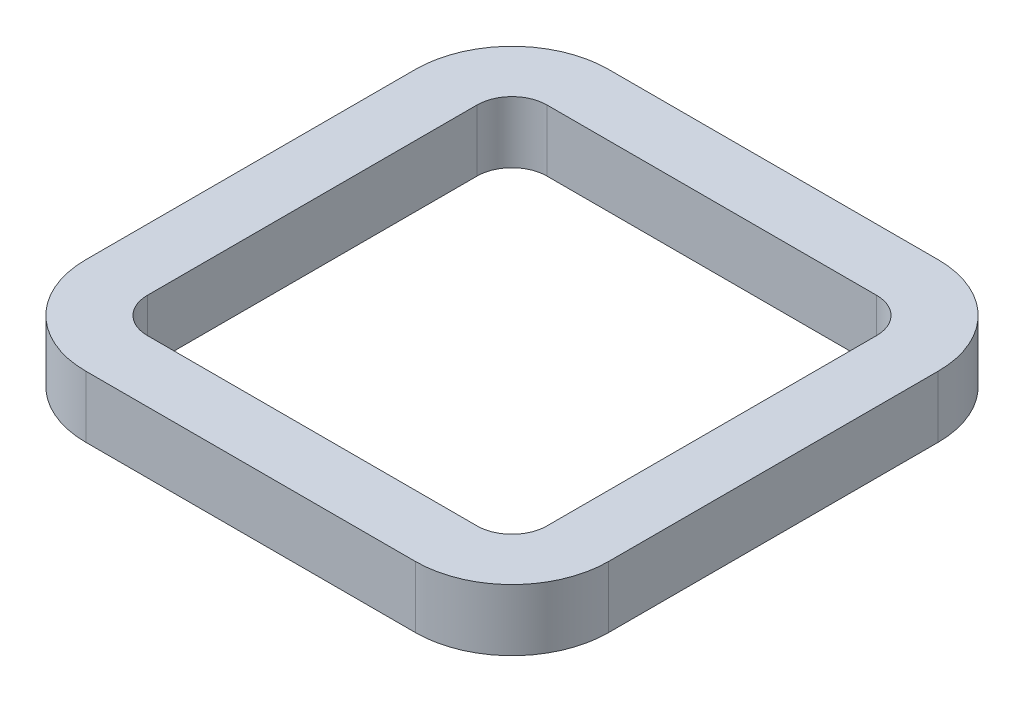
ISO-10303-21;
HEADER;
FILE_DESCRIPTION(('STEP AP214'),'2;1');
FILE_NAME('part.step','',(''),(''),'','','');
FILE_SCHEMA(('AUTOMOTIVE_DESIGN { 1 0 10303 214 1 1 1 1 }'));
ENDSEC;
DATA;
#1=APPLICATION_CONTEXT('core data for automotive mechanical design processes');
#2=APPLICATION_PROTOCOL_DEFINITION('international standard','automotive_design',2000,#1);
#3=PRODUCT_CONTEXT('',#1,'mechanical');
#4=PRODUCT('Part','Part','',(#3));
#5=PRODUCT_RELATED_PRODUCT_CATEGORY('part','',(#4));
#6=PRODUCT_DEFINITION_FORMATION('','',#4);
#7=PRODUCT_DEFINITION_CONTEXT('part definition',#1,'design');
#8=PRODUCT_DEFINITION('design','',#6,#7);
#9=PRODUCT_DEFINITION_SHAPE('','',#8);
#10=(LENGTH_UNIT() NAMED_UNIT(*) SI_UNIT(.MILLI.,.METRE.));
#11=(NAMED_UNIT(*) PLANE_ANGLE_UNIT() SI_UNIT($,.RADIAN.));
#12=(NAMED_UNIT(*) SI_UNIT($,.STERADIAN.) SOLID_ANGLE_UNIT());
#13=UNCERTAINTY_MEASURE_WITH_UNIT(LENGTH_MEASURE(1.E-05),#10,'distance_accuracy_value','');
#14=(GEOMETRIC_REPRESENTATION_CONTEXT(3) GLOBAL_UNCERTAINTY_ASSIGNED_CONTEXT((#13)) GLOBAL_UNIT_ASSIGNED_CONTEXT((#10,
#11,#12)) REPRESENTATION_CONTEXT('',''));
#15=CARTESIAN_POINT('',(0.,0.,0.));
#16=DIRECTION('',(0.,0.,1.));
#17=DIRECTION('',(1.,0.,0.));
#18=AXIS2_PLACEMENT_3D('',#15,#16,#17);
#19=CARTESIAN_POINT('',(-8.02499999999994,3.,-8.02499999999994));
#20=DIRECTION('',(0.,1.,0.));
#21=DIRECTION('',(0.,0.,1.));
#22=AXIS2_PLACEMENT_3D('',#19,#20,#21);
#23=PLANE('',#22);
#24=CARTESIAN_POINT('',(-8.02499999999994,3.,-8.02499999999994));
#25=DIRECTION('',(0.,1.,0.));
#26=DIRECTION('',(0.,0.,1.));
#27=AXIS2_PLACEMENT_3D('',#24,#25,#26);
#28=CIRCLE('',#27,4.70000000000006);
#29=CARTESIAN_POINT('',(-8.025,3.,-12.725));
#30=VERTEX_POINT('',#29);
#31=CARTESIAN_POINT('',(-12.725,3.,-8.025));
#32=VERTEX_POINT('',#31);
#33=EDGE_CURVE('E210',#30,#32,#28,.T.);
#34=ORIENTED_EDGE('',*,*,#33,.T.);
#35=DIRECTION('',(0.,0.,1.));
#36=VECTOR('',#35,1.);
#37=CARTESIAN_POINT('',(-12.725,3.,-8.025));
#38=LINE('',#37,#36);
#39=CARTESIAN_POINT('',(-12.725,3.,8.025));
#40=VERTEX_POINT('',#39);
#41=EDGE_CURVE('E213',#32,#40,#38,.T.);
#42=ORIENTED_EDGE('',*,*,#41,.T.);
#43=CARTESIAN_POINT('',(-8.02499999999994,3.,8.02500000000006));
#44=DIRECTION('',(0.,1.,0.));
#45=DIRECTION('',(0.,0.,1.));
#46=AXIS2_PLACEMENT_3D('',#43,#44,#45);
#47=CIRCLE('',#46,4.7);
#48=CARTESIAN_POINT('',(-8.02499999999994,3.,12.7250000000001));
#49=VERTEX_POINT('',#48);
#50=EDGE_CURVE('E216',#40,#49,#47,.T.);
#51=ORIENTED_EDGE('',*,*,#50,.T.);
#52=DIRECTION('',(1.,0.,0.));
#53=VECTOR('',#52,1.);
#54=CARTESIAN_POINT('',(-8.02500000000001,3.,12.725));
#55=LINE('',#54,#53);
#56=CARTESIAN_POINT('',(8.025,3.,12.725));
#57=VERTEX_POINT('',#56);
#58=EDGE_CURVE('E218',#49,#57,#55,.T.);
#59=ORIENTED_EDGE('',*,*,#58,.T.);
#60=CARTESIAN_POINT('',(8.02500000000006,3.,8.02500000000006));
#61=DIRECTION('',(0.,1.,0.));
#62=DIRECTION('',(0.,0.,1.));
#63=AXIS2_PLACEMENT_3D('',#60,#61,#62);
#64=CIRCLE('',#63,4.69999999999994);
#65=CARTESIAN_POINT('',(12.725,3.,8.025));
#66=VERTEX_POINT('',#65);
#67=EDGE_CURVE('E220',#57,#66,#64,.T.);
#68=ORIENTED_EDGE('',*,*,#67,.T.);
#69=DIRECTION('',(0.,0.,-1.));
#70=VECTOR('',#69,1.);
#71=CARTESIAN_POINT('',(12.725,3.,-8.025));
#72=LINE('',#71,#70);
#73=CARTESIAN_POINT('',(12.725,3.,-8.025));
#74=VERTEX_POINT('',#73);
#75=EDGE_CURVE('E222',#66,#74,#72,.T.);
#76=ORIENTED_EDGE('',*,*,#75,.T.);
#77=CARTESIAN_POINT('',(8.02499999999983,3.,-8.02499999999995));
#78=DIRECTION('',(0.,1.,0.));
#79=DIRECTION('',(0.,0.,1.));
#80=AXIS2_PLACEMENT_3D('',#77,#78,#79);
#81=CIRCLE('',#80,4.70000000000009);
#82=CARTESIAN_POINT('',(8.02500000000031,3.,-12.725));
#83=VERTEX_POINT('',#82);
#84=EDGE_CURVE('E224',#74,#83,#81,.T.);
#85=ORIENTED_EDGE('',*,*,#84,.T.);
#86=DIRECTION('',(-1.,0.,0.));
#87=VECTOR('',#86,1.);
#88=CARTESIAN_POINT('',(8.02500000000031,3.,-12.7249999999999));
#89=LINE('',#88,#87);
#90=EDGE_CURVE('E226',#83,#30,#89,.T.);
#91=ORIENTED_EDGE('',*,*,#90,.T.);
#92=EDGE_LOOP('',(#34,#42,#51,#59,#68,#76,#85,#91));
#93=FACE_BOUND('',#92,.T.);
#94=DIRECTION('',(1.,0.,0.));
#95=VECTOR('',#94,1.);
#96=CARTESIAN_POINT('',(-8.025,3.,9.725));
#97=LINE('',#96,#95);
#98=CARTESIAN_POINT('',(-8.025,3.,9.725));
#99=VERTEX_POINT('',#98);
#100=CARTESIAN_POINT('',(8.025,3.,9.725));
#101=VERTEX_POINT('',#100);
#102=EDGE_CURVE('E153',#99,#101,#97,.T.);
#103=ORIENTED_EDGE('',*,*,#102,.F.);
#104=CARTESIAN_POINT('',(-8.02499999999994,3.,8.02500000000006));
#105=DIRECTION('',(0.,1.,0.));
#106=DIRECTION('',(0.,0.,1.));
#107=AXIS2_PLACEMENT_3D('',#104,#105,#106);
#108=CIRCLE('',#107,1.7);
#109=CARTESIAN_POINT('',(-9.725,3.,8.025));
#110=VERTEX_POINT('',#109);
#111=EDGE_CURVE('E145',#110,#99,#108,.T.);
#112=ORIENTED_EDGE('',*,*,#111,.F.);
#113=DIRECTION('',(0.,0.,1.));
#114=VECTOR('',#113,1.);
#115=CARTESIAN_POINT('',(-9.725,3.,-8.025));
#116=LINE('',#115,#114);
#117=CARTESIAN_POINT('',(-9.725,3.,-8.025));
#118=VERTEX_POINT('',#117);
#119=EDGE_CURVE('E178',#118,#110,#116,.T.);
#120=ORIENTED_EDGE('',*,*,#119,.F.);
#121=CARTESIAN_POINT('',(-8.02499999999994,3.,-8.02499999999994));
#122=DIRECTION('',(0.,1.,0.));
#123=DIRECTION('',(0.,0.,1.));
#124=AXIS2_PLACEMENT_3D('',#121,#122,#123);
#125=CIRCLE('',#124,1.70000000000006);
#126=CARTESIAN_POINT('',(-8.025,3.,-9.725));
#127=VERTEX_POINT('',#126);
#128=EDGE_CURVE('E176',#127,#118,#125,.T.);
#129=ORIENTED_EDGE('',*,*,#128,.F.);
#130=DIRECTION('',(-1.,0.,0.));
#131=VECTOR('',#130,1.);
#132=CARTESIAN_POINT('',(8.025,3.,-9.725));
#133=LINE('',#132,#131);
#134=CARTESIAN_POINT('',(8.025,3.,-9.72500000000006));
#135=VERTEX_POINT('',#134);
#136=EDGE_CURVE('E174',#135,#127,#133,.T.);
#137=ORIENTED_EDGE('',*,*,#136,.F.);
#138=CARTESIAN_POINT('',(8.02499999999983,3.,-8.02499999999995));
#139=DIRECTION('',(0.,1.,0.));
#140=DIRECTION('',(0.,0.,1.));
#141=AXIS2_PLACEMENT_3D('',#138,#139,#140);
#142=CIRCLE('',#141,1.70000000000011);
#143=CARTESIAN_POINT('',(9.725,3.,-8.025));
#144=VERTEX_POINT('',#143);
#145=EDGE_CURVE('E172',#144,#135,#142,.T.);
#146=ORIENTED_EDGE('',*,*,#145,.F.);
#147=DIRECTION('',(0.,0.,-1.));
#148=VECTOR('',#147,1.);
#149=CARTESIAN_POINT('',(9.725,3.,-8.025));
#150=LINE('',#149,#148);
#151=CARTESIAN_POINT('',(9.725,3.,8.025));
#152=VERTEX_POINT('',#151);
#153=EDGE_CURVE('E168',#152,#144,#150,.T.);
#154=ORIENTED_EDGE('',*,*,#153,.F.);
#155=CARTESIAN_POINT('',(8.02500000000006,3.,8.02500000000006));
#156=DIRECTION('',(0.,1.,0.));
#157=DIRECTION('',(0.,0.,1.));
#158=AXIS2_PLACEMENT_3D('',#155,#156,#157);
#159=CIRCLE('',#158,1.69999999999994);
#160=EDGE_CURVE('E166',#101,#152,#159,.T.);
#161=ORIENTED_EDGE('',*,*,#160,.F.);
#162=EDGE_LOOP('',(#103,#112,#120,#129,#137,#146,#154,#161));
#163=FACE_BOUND('',#162,.T.);
#164=ADVANCED_FACE('F32',(#93,#163),#23,.T.);
#165=CARTESIAN_POINT('',(-8.02499999999994,0.,-8.02499999999994));
#166=DIRECTION('',(0.,1.,0.));
#167=DIRECTION('',(0.,0.,1.));
#168=AXIS2_PLACEMENT_3D('',#165,#166,#167);
#169=PLANE('',#168);
#170=CARTESIAN_POINT('',(-8.02499999999994,0.,-8.02499999999994));
#171=DIRECTION('',(0.,1.,0.));
#172=DIRECTION('',(0.,0.,1.));
#173=AXIS2_PLACEMENT_3D('',#170,#171,#172);
#174=CIRCLE('',#173,4.70000000000006);
#175=CARTESIAN_POINT('',(-8.025,0.,-12.725));
#176=VERTEX_POINT('',#175);
#177=CARTESIAN_POINT('',(-12.725,0.,-8.025));
#178=VERTEX_POINT('',#177);
#179=EDGE_CURVE('E161',#176,#178,#174,.T.);
#180=ORIENTED_EDGE('',*,*,#179,.F.);
#181=DIRECTION('',(-1.,0.,0.));
#182=VECTOR('',#181,1.);
#183=CARTESIAN_POINT('',(8.02500000000031,0.,-12.7249999999999));
#184=LINE('',#183,#182);
#185=CARTESIAN_POINT('',(8.02500000000031,0.,-12.725));
#186=VERTEX_POINT('',#185);
#187=EDGE_CURVE('E214',#186,#176,#184,.T.);
#188=ORIENTED_EDGE('',*,*,#187,.F.);
#189=CARTESIAN_POINT('',(8.02499999999983,0.,-8.02499999999995));
#190=DIRECTION('',(0.,1.,0.));
#191=DIRECTION('',(0.,0.,1.));
#192=AXIS2_PLACEMENT_3D('',#189,#190,#191);
#193=CIRCLE('',#192,4.70000000000009);
#194=CARTESIAN_POINT('',(12.725,0.,-8.025));
#195=VERTEX_POINT('',#194);
#196=EDGE_CURVE('E241',#195,#186,#193,.T.);
#197=ORIENTED_EDGE('',*,*,#196,.F.);
#198=DIRECTION('',(0.,0.,-1.));
#199=VECTOR('',#198,1.);
#200=CARTESIAN_POINT('',(12.725,0.,-8.025));
#201=LINE('',#200,#199);
#202=CARTESIAN_POINT('',(12.725,0.,8.025));
#203=VERTEX_POINT('',#202);
#204=EDGE_CURVE('E239',#203,#195,#201,.T.);
#205=ORIENTED_EDGE('',*,*,#204,.F.);
#206=CARTESIAN_POINT('',(8.02500000000006,0.,8.02500000000006));
#207=DIRECTION('',(0.,1.,0.));
#208=DIRECTION('',(0.,0.,1.));
#209=AXIS2_PLACEMENT_3D('',#206,#207,#208);
#210=CIRCLE('',#209,4.69999999999994);
#211=CARTESIAN_POINT('',(8.025,0.,12.725));
#212=VERTEX_POINT('',#211);
#213=EDGE_CURVE('E237',#212,#203,#210,.T.);
#214=ORIENTED_EDGE('',*,*,#213,.F.);
#215=DIRECTION('',(1.,0.,0.));
#216=VECTOR('',#215,1.);
#217=CARTESIAN_POINT('',(-8.02500000000001,0.,12.725));
#218=LINE('',#217,#216);
#219=CARTESIAN_POINT('',(-8.02499999999994,0.,12.7250000000001));
#220=VERTEX_POINT('',#219);
#221=EDGE_CURVE('E235',#220,#212,#218,.T.);
#222=ORIENTED_EDGE('',*,*,#221,.F.);
#223=CARTESIAN_POINT('',(-8.02499999999994,0.,8.02500000000006));
#224=DIRECTION('',(0.,1.,0.));
#225=DIRECTION('',(0.,0.,1.));
#226=AXIS2_PLACEMENT_3D('',#223,#224,#225);
#227=CIRCLE('',#226,4.7);
#228=CARTESIAN_POINT('',(-12.725,0.,8.025));
#229=VERTEX_POINT('',#228);
#230=EDGE_CURVE('E233',#229,#220,#227,.T.);
#231=ORIENTED_EDGE('',*,*,#230,.F.);
#232=DIRECTION('',(0.,0.,1.));
#233=VECTOR('',#232,1.);
#234=CARTESIAN_POINT('',(-12.725,0.,-8.025));
#235=LINE('',#234,#233);
#236=EDGE_CURVE('E231',#178,#229,#235,.T.);
#237=ORIENTED_EDGE('',*,*,#236,.F.);
#238=EDGE_LOOP('',(#180,#188,#197,#205,#214,#222,#231,#237));
#239=FACE_BOUND('',#238,.T.);
#240=CARTESIAN_POINT('',(-8.02499999999994,0.,8.02500000000006));
#241=DIRECTION('',(0.,1.,0.));
#242=DIRECTION('',(0.,0.,1.));
#243=AXIS2_PLACEMENT_3D('',#240,#241,#242);
#244=CIRCLE('',#243,1.7);
#245=CARTESIAN_POINT('',(-9.725,0.,8.025));
#246=VERTEX_POINT('',#245);
#247=CARTESIAN_POINT('',(-8.025,0.,9.725));
#248=VERTEX_POINT('',#247);
#249=EDGE_CURVE('E55',#246,#248,#244,.T.);
#250=ORIENTED_EDGE('',*,*,#249,.T.);
#251=DIRECTION('',(1.,0.,0.));
#252=VECTOR('',#251,1.);
#253=CARTESIAN_POINT('',(-8.025,0.,9.725));
#254=LINE('',#253,#252);
#255=CARTESIAN_POINT('',(8.025,0.,9.725));
#256=VERTEX_POINT('',#255);
#257=EDGE_CURVE('E160',#248,#256,#254,.T.);
#258=ORIENTED_EDGE('',*,*,#257,.T.);
#259=CARTESIAN_POINT('',(8.02500000000006,0.,8.02500000000006));
#260=DIRECTION('',(0.,1.,0.));
#261=DIRECTION('',(0.,0.,1.));
#262=AXIS2_PLACEMENT_3D('',#259,#260,#261);
#263=CIRCLE('',#262,1.69999999999994);
#264=CARTESIAN_POINT('',(9.725,0.,8.025));
#265=VERTEX_POINT('',#264);
#266=EDGE_CURVE('E182',#256,#265,#263,.T.);
#267=ORIENTED_EDGE('',*,*,#266,.T.);
#268=DIRECTION('',(0.,0.,-1.));
#269=VECTOR('',#268,1.);
#270=CARTESIAN_POINT('',(9.725,0.,-8.025));
#271=LINE('',#270,#269);
#272=CARTESIAN_POINT('',(9.725,0.,-8.025));
#273=VERTEX_POINT('',#272);
#274=EDGE_CURVE('E185',#265,#273,#271,.T.);
#275=ORIENTED_EDGE('',*,*,#274,.T.);
#276=CARTESIAN_POINT('',(8.02499999999983,0.,-8.02499999999995));
#277=DIRECTION('',(0.,1.,0.));
#278=DIRECTION('',(0.,0.,1.));
#279=AXIS2_PLACEMENT_3D('',#276,#277,#278);
#280=CIRCLE('',#279,1.70000000000011);
#281=CARTESIAN_POINT('',(8.025,0.,-9.72500000000006));
#282=VERTEX_POINT('',#281);
#283=EDGE_CURVE('E188',#273,#282,#280,.T.);
#284=ORIENTED_EDGE('',*,*,#283,.T.);
#285=DIRECTION('',(-1.,0.,0.));
#286=VECTOR('',#285,1.);
#287=CARTESIAN_POINT('',(8.025,0.,-9.725));
#288=LINE('',#287,#286);
#289=CARTESIAN_POINT('',(-8.025,0.,-9.725));
#290=VERTEX_POINT('',#289);
#291=EDGE_CURVE('E191',#282,#290,#288,.T.);
#292=ORIENTED_EDGE('',*,*,#291,.T.);
#293=CARTESIAN_POINT('',(-8.02499999999994,0.,-8.02499999999994));
#294=DIRECTION('',(0.,1.,0.));
#295=DIRECTION('',(0.,0.,1.));
#296=AXIS2_PLACEMENT_3D('',#293,#294,#295);
#297=CIRCLE('',#296,1.70000000000006);
#298=CARTESIAN_POINT('',(-9.725,0.,-8.025));
#299=VERTEX_POINT('',#298);
#300=EDGE_CURVE('E194',#290,#299,#297,.T.);
#301=ORIENTED_EDGE('',*,*,#300,.T.);
#302=DIRECTION('',(0.,0.,1.));
#303=VECTOR('',#302,1.);
#304=CARTESIAN_POINT('',(-9.725,0.,-8.025));
#305=LINE('',#304,#303);
#306=EDGE_CURVE('E154',#299,#246,#305,.T.);
#307=ORIENTED_EDGE('',*,*,#306,.T.);
#308=EDGE_LOOP('',(#250,#258,#267,#275,#284,#292,#301,#307));
#309=FACE_BOUND('',#308,.T.);
#310=ADVANCED_FACE('F271',(#239,#309),#169,.F.);
#311=CARTESIAN_POINT('',(-8.02499999999994,3.,-8.02499999999994));
#312=DIRECTION('',(0.,-1.,0.));
#313=DIRECTION('',(0.,0.,-1.));
#314=AXIS2_PLACEMENT_3D('',#311,#312,#313);
#315=CYLINDRICAL_SURFACE('',#314,4.70000000000006);
#316=ORIENTED_EDGE('',*,*,#179,.T.);
#317=DIRECTION('',(0.,-1.,0.));
#318=VECTOR('',#317,1.);
#319=CARTESIAN_POINT('',(-12.725,3.,-8.025));
#320=LINE('',#319,#318);
#321=EDGE_CURVE('E11',#32,#178,#320,.T.);
#322=ORIENTED_EDGE('',*,*,#321,.F.);
#323=ORIENTED_EDGE('',*,*,#33,.F.);
#324=DIRECTION('',(0.,-1.,0.));
#325=VECTOR('',#324,1.);
#326=CARTESIAN_POINT('',(-8.025,3.,-12.725));
#327=LINE('',#326,#325);
#328=EDGE_CURVE('E228',#30,#176,#327,.T.);
#329=ORIENTED_EDGE('',*,*,#328,.T.);
#330=EDGE_LOOP('',(#316,#322,#323,#329));
#331=FACE_BOUND('',#330,.T.);
#332=ADVANCED_FACE('F34',(#331),#315,.T.);
#333=CARTESIAN_POINT('',(-12.725,3.,-8.025));
#334=DIRECTION('',(1.,0.,0.));
#335=DIRECTION('',(0.,0.,-1.));
#336=AXIS2_PLACEMENT_3D('',#333,#334,#335);
#337=PLANE('',#336);
#338=ORIENTED_EDGE('',*,*,#236,.T.);
#339=DIRECTION('',(0.,-1.,0.));
#340=VECTOR('',#339,1.);
#341=CARTESIAN_POINT('',(-12.725,3.,8.025));
#342=LINE('',#341,#340);
#343=EDGE_CURVE('E40',#40,#229,#342,.T.);
#344=ORIENTED_EDGE('',*,*,#343,.F.);
#345=ORIENTED_EDGE('',*,*,#41,.F.);
#346=ORIENTED_EDGE('',*,*,#321,.T.);
#347=EDGE_LOOP('',(#338,#344,#345,#346));
#348=FACE_BOUND('',#347,.T.);
#349=ADVANCED_FACE('F288',(#348),#337,.F.);
#350=CARTESIAN_POINT('',(-8.02499999999994,3.,8.02500000000006));
#351=DIRECTION('',(0.,-1.,0.));
#352=DIRECTION('',(0.,0.,-1.));
#353=AXIS2_PLACEMENT_3D('',#350,#351,#352);
#354=CYLINDRICAL_SURFACE('',#353,4.7);
#355=ORIENTED_EDGE('',*,*,#230,.T.);
#356=DIRECTION('',(0.,-1.,0.));
#357=VECTOR('',#356,1.);
#358=CARTESIAN_POINT('',(-8.02499999999994,3.,12.7250000000001));
#359=LINE('',#358,#357);
#360=EDGE_CURVE('E258',#49,#220,#359,.T.);
#361=ORIENTED_EDGE('',*,*,#360,.F.);
#362=ORIENTED_EDGE('',*,*,#50,.F.);
#363=ORIENTED_EDGE('',*,*,#343,.T.);
#364=EDGE_LOOP('',(#355,#361,#362,#363));
#365=FACE_BOUND('',#364,.T.);
#366=ADVANCED_FACE('F265',(#365),#354,.T.);
#367=CARTESIAN_POINT('',(-8.02500000000001,3.,12.725));
#368=DIRECTION('',(0.,0.,-1.));
#369=DIRECTION('',(-1.,0.,0.));
#370=AXIS2_PLACEMENT_3D('',#367,#368,#369);
#371=PLANE('',#370);
#372=ORIENTED_EDGE('',*,*,#221,.T.);
#373=DIRECTION('',(0.,-1.,0.));
#374=VECTOR('',#373,1.);
#375=CARTESIAN_POINT('',(8.025,3.,12.725));
#376=LINE('',#375,#374);
#377=EDGE_CURVE('E255',#57,#212,#376,.T.);
#378=ORIENTED_EDGE('',*,*,#377,.F.);
#379=ORIENTED_EDGE('',*,*,#58,.F.);
#380=ORIENTED_EDGE('',*,*,#360,.T.);
#381=EDGE_LOOP('',(#372,#378,#379,#380));
#382=FACE_BOUND('',#381,.T.);
#383=ADVANCED_FACE('F277',(#382),#371,.F.);
#384=CARTESIAN_POINT('',(8.02500000000006,3.,8.02500000000006));
#385=DIRECTION('',(0.,-1.,0.));
#386=DIRECTION('',(0.,0.,-1.));
#387=AXIS2_PLACEMENT_3D('',#384,#385,#386);
#388=CYLINDRICAL_SURFACE('',#387,4.69999999999994);
#389=ORIENTED_EDGE('',*,*,#213,.T.);
#390=DIRECTION('',(0.,-1.,0.));
#391=VECTOR('',#390,1.);
#392=CARTESIAN_POINT('',(12.725,3.,8.025));
#393=LINE('',#392,#391);
#394=EDGE_CURVE('E252',#66,#203,#393,.T.);
#395=ORIENTED_EDGE('',*,*,#394,.F.);
#396=ORIENTED_EDGE('',*,*,#67,.F.);
#397=ORIENTED_EDGE('',*,*,#377,.T.);
#398=EDGE_LOOP('',(#389,#395,#396,#397));
#399=FACE_BOUND('',#398,.T.);
#400=ADVANCED_FACE('F281',(#399),#388,.T.);
#401=CARTESIAN_POINT('',(12.725,3.,-8.025));
#402=DIRECTION('',(-1.,0.,0.));
#403=DIRECTION('',(0.,0.,1.));
#404=AXIS2_PLACEMENT_3D('',#401,#402,#403);
#405=PLANE('',#404);
#406=ORIENTED_EDGE('',*,*,#204,.T.);
#407=DIRECTION('',(0.,-1.,0.));
#408=VECTOR('',#407,1.);
#409=CARTESIAN_POINT('',(12.725,3.,-8.025));
#410=LINE('',#409,#408);
#411=EDGE_CURVE('E249',#74,#195,#410,.T.);
#412=ORIENTED_EDGE('',*,*,#411,.F.);
#413=ORIENTED_EDGE('',*,*,#75,.F.);
#414=ORIENTED_EDGE('',*,*,#394,.T.);
#415=EDGE_LOOP('',(#406,#412,#413,#414));
#416=FACE_BOUND('',#415,.T.);
#417=ADVANCED_FACE('F301',(#416),#405,.F.);
#418=CARTESIAN_POINT('',(8.02499999999983,3.,-8.02499999999995));
#419=DIRECTION('',(0.,-1.,0.));
#420=DIRECTION('',(0.,0.,-1.));
#421=AXIS2_PLACEMENT_3D('',#418,#419,#420);
#422=CYLINDRICAL_SURFACE('',#421,4.70000000000009);
#423=ORIENTED_EDGE('',*,*,#196,.T.);
#424=DIRECTION('',(0.,-1.,0.));
#425=VECTOR('',#424,1.);
#426=CARTESIAN_POINT('',(8.02500000000031,3.,-12.725));
#427=LINE('',#426,#425);
#428=EDGE_CURVE('E246',#83,#186,#427,.T.);
#429=ORIENTED_EDGE('',*,*,#428,.F.);
#430=ORIENTED_EDGE('',*,*,#84,.F.);
#431=ORIENTED_EDGE('',*,*,#411,.T.);
#432=EDGE_LOOP('',(#423,#429,#430,#431));
#433=FACE_BOUND('',#432,.T.);
#434=ADVANCED_FACE('F299',(#433),#422,.T.);
#435=CARTESIAN_POINT('',(8.02500000000031,3.,-12.7249999999999));
#436=DIRECTION('',(0.,0.,1.));
#437=DIRECTION('',(1.,0.,0.));
#438=AXIS2_PLACEMENT_3D('',#435,#436,#437);
#439=PLANE('',#438);
#440=ORIENTED_EDGE('',*,*,#187,.T.);
#441=ORIENTED_EDGE('',*,*,#328,.F.);
#442=ORIENTED_EDGE('',*,*,#90,.F.);
#443=ORIENTED_EDGE('',*,*,#428,.T.);
#444=EDGE_LOOP('',(#440,#441,#442,#443));
#445=FACE_BOUND('',#444,.T.);
#446=ADVANCED_FACE('F294',(#445),#439,.F.);
#447=CARTESIAN_POINT('',(-8.02499999999994,3.,8.02500000000006));
#448=DIRECTION('',(0.,-1.,0.));
#449=DIRECTION('',(0.,0.,-1.));
#450=AXIS2_PLACEMENT_3D('',#447,#448,#449);
#451=CYLINDRICAL_SURFACE('',#450,1.7);
#452=ORIENTED_EDGE('',*,*,#249,.F.);
#453=DIRECTION('',(0.,-1.,0.));
#454=VECTOR('',#453,1.);
#455=CARTESIAN_POINT('',(-9.725,3.,8.025));
#456=LINE('',#455,#454);
#457=EDGE_CURVE('E149',#110,#246,#456,.T.);
#458=ORIENTED_EDGE('',*,*,#457,.F.);
#459=ORIENTED_EDGE('',*,*,#111,.T.);
#460=DIRECTION('',(0.,-1.,0.));
#461=VECTOR('',#460,1.);
#462=CARTESIAN_POINT('',(-8.025,3.,9.725));
#463=LINE('',#462,#461);
#464=EDGE_CURVE('E148',#99,#248,#463,.T.);
#465=ORIENTED_EDGE('',*,*,#464,.T.);
#466=EDGE_LOOP('',(#452,#458,#459,#465));
#467=FACE_BOUND('',#466,.T.);
#468=ADVANCED_FACE('F147',(#467),#451,.F.);
#469=CARTESIAN_POINT('',(-8.025,3.,9.725));
#470=DIRECTION('',(0.,0.,-1.));
#471=DIRECTION('',(-1.,0.,0.));
#472=AXIS2_PLACEMENT_3D('',#469,#470,#471);
#473=PLANE('',#472);
#474=ORIENTED_EDGE('',*,*,#257,.F.);
#475=ORIENTED_EDGE('',*,*,#464,.F.);
#476=ORIENTED_EDGE('',*,*,#102,.T.);
#477=DIRECTION('',(0.,-1.,0.));
#478=VECTOR('',#477,1.);
#479=CARTESIAN_POINT('',(8.025,3.,9.725));
#480=LINE('',#479,#478);
#481=EDGE_CURVE('E162',#101,#256,#480,.T.);
#482=ORIENTED_EDGE('',*,*,#481,.T.);
#483=EDGE_LOOP('',(#474,#475,#476,#482));
#484=FACE_BOUND('',#483,.T.);
#485=ADVANCED_FACE('F157',(#484),#473,.T.);
#486=CARTESIAN_POINT('',(8.02500000000006,3.,8.02500000000006));
#487=DIRECTION('',(0.,-1.,0.));
#488=DIRECTION('',(0.,0.,-1.));
#489=AXIS2_PLACEMENT_3D('',#486,#487,#488);
#490=CYLINDRICAL_SURFACE('',#489,1.69999999999994);
#491=ORIENTED_EDGE('',*,*,#266,.F.);
#492=ORIENTED_EDGE('',*,*,#481,.F.);
#493=ORIENTED_EDGE('',*,*,#160,.T.);
#494=DIRECTION('',(0.,-1.,0.));
#495=VECTOR('',#494,1.);
#496=CARTESIAN_POINT('',(9.725,3.,8.025));
#497=LINE('',#496,#495);
#498=EDGE_CURVE('E207',#152,#265,#497,.T.);
#499=ORIENTED_EDGE('',*,*,#498,.T.);
#500=EDGE_LOOP('',(#491,#492,#493,#499));
#501=FACE_BOUND('',#500,.T.);
#502=ADVANCED_FACE('F326',(#501),#490,.F.);
#503=CARTESIAN_POINT('',(9.725,3.,-8.025));
#504=DIRECTION('',(-1.,0.,0.));
#505=DIRECTION('',(0.,0.,1.));
#506=AXIS2_PLACEMENT_3D('',#503,#504,#505);
#507=PLANE('',#506);
#508=ORIENTED_EDGE('',*,*,#274,.F.);
#509=ORIENTED_EDGE('',*,*,#498,.F.);
#510=ORIENTED_EDGE('',*,*,#153,.T.);
#511=DIRECTION('',(0.,-1.,0.));
#512=VECTOR('',#511,1.);
#513=CARTESIAN_POINT('',(9.725,3.,-8.025));
#514=LINE('',#513,#512);
#515=EDGE_CURVE('E205',#144,#273,#514,.T.);
#516=ORIENTED_EDGE('',*,*,#515,.T.);
#517=EDGE_LOOP('',(#508,#509,#510,#516));
#518=FACE_BOUND('',#517,.T.);
#519=ADVANCED_FACE('F330',(#518),#507,.T.);
#520=CARTESIAN_POINT('',(8.02499999999983,3.,-8.02499999999995));
#521=DIRECTION('',(0.,-1.,0.));
#522=DIRECTION('',(0.,0.,-1.));
#523=AXIS2_PLACEMENT_3D('',#520,#521,#522);
#524=CYLINDRICAL_SURFACE('',#523,1.70000000000011);
#525=ORIENTED_EDGE('',*,*,#283,.F.);
#526=ORIENTED_EDGE('',*,*,#515,.F.);
#527=ORIENTED_EDGE('',*,*,#145,.T.);
#528=DIRECTION('',(0.,-1.,0.));
#529=VECTOR('',#528,1.);
#530=CARTESIAN_POINT('',(8.025,3.,-9.72500000000006));
#531=LINE('',#530,#529);
#532=EDGE_CURVE('E203',#135,#282,#531,.T.);
#533=ORIENTED_EDGE('',*,*,#532,.T.);
#534=EDGE_LOOP('',(#525,#526,#527,#533));
#535=FACE_BOUND('',#534,.T.);
#536=ADVANCED_FACE('F336',(#535),#524,.F.);
#537=CARTESIAN_POINT('',(8.025,3.,-9.725));
#538=DIRECTION('',(0.,0.,1.));
#539=DIRECTION('',(1.,0.,0.));
#540=AXIS2_PLACEMENT_3D('',#537,#538,#539);
#541=PLANE('',#540);
#542=ORIENTED_EDGE('',*,*,#291,.F.);
#543=ORIENTED_EDGE('',*,*,#532,.F.);
#544=ORIENTED_EDGE('',*,*,#136,.T.);
#545=DIRECTION('',(0.,-1.,0.));
#546=VECTOR('',#545,1.);
#547=CARTESIAN_POINT('',(-8.025,3.,-9.725));
#548=LINE('',#547,#546);
#549=EDGE_CURVE('E201',#127,#290,#548,.T.);
#550=ORIENTED_EDGE('',*,*,#549,.T.);
#551=EDGE_LOOP('',(#542,#543,#544,#550));
#552=FACE_BOUND('',#551,.T.);
#553=ADVANCED_FACE('F340',(#552),#541,.T.);
#554=CARTESIAN_POINT('',(-8.02499999999994,3.,-8.02499999999994));
#555=DIRECTION('',(0.,-1.,0.));
#556=DIRECTION('',(0.,0.,-1.));
#557=AXIS2_PLACEMENT_3D('',#554,#555,#556);
#558=CYLINDRICAL_SURFACE('',#557,1.70000000000006);
#559=ORIENTED_EDGE('',*,*,#300,.F.);
#560=ORIENTED_EDGE('',*,*,#549,.F.);
#561=ORIENTED_EDGE('',*,*,#128,.T.);
#562=DIRECTION('',(0.,-1.,0.));
#563=VECTOR('',#562,1.);
#564=CARTESIAN_POINT('',(-9.725,3.,-8.025));
#565=LINE('',#564,#563);
#566=EDGE_CURVE('E47',#118,#299,#565,.T.);
#567=ORIENTED_EDGE('',*,*,#566,.T.);
#568=EDGE_LOOP('',(#559,#560,#561,#567));
#569=FACE_BOUND('',#568,.T.);
#570=ADVANCED_FACE('F344',(#569),#558,.F.);
#571=CARTESIAN_POINT('',(-9.725,3.,-8.025));
#572=DIRECTION('',(1.,0.,0.));
#573=DIRECTION('',(0.,0.,-1.));
#574=AXIS2_PLACEMENT_3D('',#571,#572,#573);
#575=PLANE('',#574);
#576=ORIENTED_EDGE('',*,*,#306,.F.);
#577=ORIENTED_EDGE('',*,*,#566,.F.);
#578=ORIENTED_EDGE('',*,*,#119,.T.);
#579=ORIENTED_EDGE('',*,*,#457,.T.);
#580=EDGE_LOOP('',(#576,#577,#578,#579));
#581=FACE_BOUND('',#580,.T.);
#582=ADVANCED_FACE('F348',(#581),#575,.T.);
#583=CLOSED_SHELL('',(#164,#310,#332,#349,#366,#383,#400,#417,#434,#446,#468,#485,#502,#519,
#536,#553,#570,#582));
#584=MANIFOLD_SOLID_BREP('B2',#583);
#585=ADVANCED_BREP_SHAPE_REPRESENTATION('',(#18,#584),#14);
#586=SHAPE_DEFINITION_REPRESENTATION(#9,#585);
ENDSEC;
END-ISO-10303-21;
